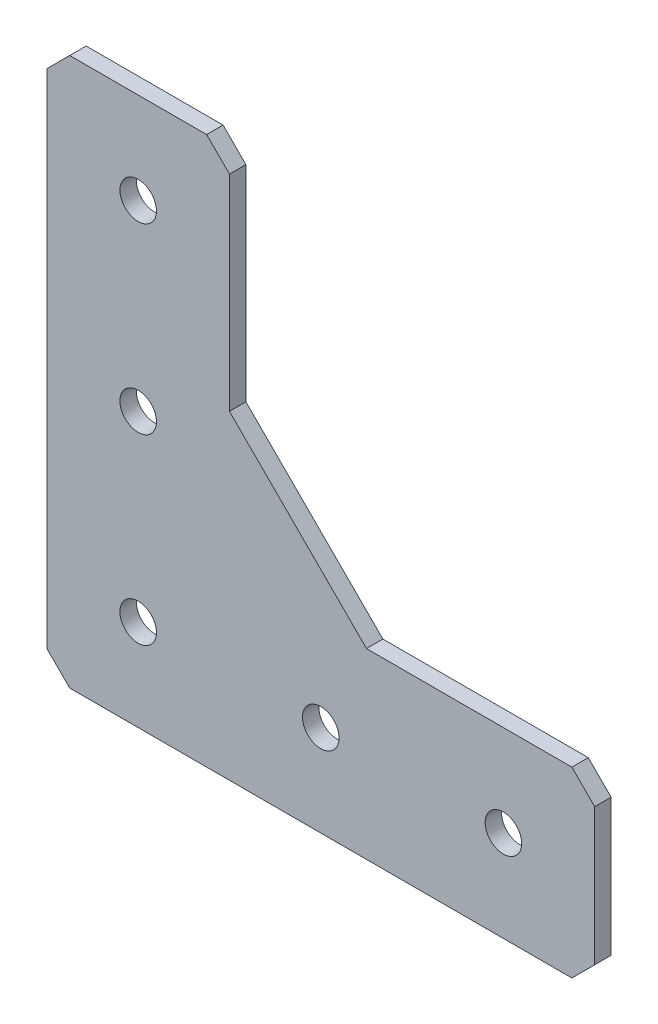
ISO-10303-21;
HEADER;
FILE_DESCRIPTION(('STEP AP214'),'2;1');
FILE_NAME('part.step','',(''),(''),'','','');
FILE_SCHEMA(('AUTOMOTIVE_DESIGN { 1 0 10303 214 1 1 1 1 }'));
ENDSEC;
DATA;
#1=APPLICATION_CONTEXT('core data for automotive mechanical design processes');
#2=APPLICATION_PROTOCOL_DEFINITION('international standard','automotive_design',2000,#1);
#3=PRODUCT_CONTEXT('',#1,'mechanical');
#4=PRODUCT('Part','Part','',(#3));
#5=PRODUCT_RELATED_PRODUCT_CATEGORY('part','',(#4));
#6=PRODUCT_DEFINITION_FORMATION('','',#4);
#7=PRODUCT_DEFINITION_CONTEXT('part definition',#1,'design');
#8=PRODUCT_DEFINITION('design','',#6,#7);
#9=PRODUCT_DEFINITION_SHAPE('','',#8);
#10=(LENGTH_UNIT() NAMED_UNIT(*) SI_UNIT(.MILLI.,.METRE.));
#11=(NAMED_UNIT(*) PLANE_ANGLE_UNIT() SI_UNIT($,.RADIAN.));
#12=(NAMED_UNIT(*) SI_UNIT($,.STERADIAN.) SOLID_ANGLE_UNIT());
#13=UNCERTAINTY_MEASURE_WITH_UNIT(LENGTH_MEASURE(1.E-05),#10,'distance_accuracy_value','');
#14=(GEOMETRIC_REPRESENTATION_CONTEXT(3) GLOBAL_UNCERTAINTY_ASSIGNED_CONTEXT((#13)) GLOBAL_UNIT_ASSIGNED_CONTEXT((#10,
#11,#12)) REPRESENTATION_CONTEXT('',''));
#15=CARTESIAN_POINT('',(0.,0.,0.));
#16=DIRECTION('',(0.,0.,1.));
#17=DIRECTION('',(1.,0.,0.));
#18=AXIS2_PLACEMENT_3D('',#15,#16,#17);
#19=CARTESIAN_POINT('',(44.45,25.4,2.286));
#20=DIRECTION('',(0.,1.,0.));
#21=DIRECTION('',(-1.,0.,0.));
#22=AXIS2_PLACEMENT_3D('',#19,#20,#21);
#23=PLANE('',#22);
#24=DIRECTION('',(1.,0.,0.));
#25=VECTOR('',#24,1.);
#26=CARTESIAN_POINT('',(44.45,25.4,0.));
#27=LINE('',#26,#25);
#28=CARTESIAN_POINT('',(44.45,25.4,0.));
#29=VERTEX_POINT('',#28);
#30=CARTESIAN_POINT('',(73.0249999999999,25.4,0.));
#31=VERTEX_POINT('',#30);
#32=EDGE_CURVE('E156',#29,#31,#27,.T.);
#33=ORIENTED_EDGE('',*,*,#32,.F.);
#34=DIRECTION('',(0.,0.,-1.));
#35=VECTOR('',#34,1.);
#36=CARTESIAN_POINT('',(44.45,25.4,2.286));
#37=LINE('',#36,#35);
#38=CARTESIAN_POINT('',(44.45,25.4,2.286));
#39=VERTEX_POINT('',#38);
#40=EDGE_CURVE('E11',#39,#29,#37,.T.);
#41=ORIENTED_EDGE('',*,*,#40,.F.);
#42=DIRECTION('',(1.,0.,0.));
#43=VECTOR('',#42,1.);
#44=CARTESIAN_POINT('',(44.45,25.4,2.286));
#45=LINE('',#44,#43);
#46=CARTESIAN_POINT('',(73.0249999999999,25.4,2.286));
#47=VERTEX_POINT('',#46);
#48=EDGE_CURVE('E189',#39,#47,#45,.T.);
#49=ORIENTED_EDGE('',*,*,#48,.T.);
#50=DIRECTION('',(0.,0.,-1.));
#51=VECTOR('',#50,1.);
#52=CARTESIAN_POINT('',(73.0249999999999,25.4,2.286));
#53=LINE('',#52,#51);
#54=EDGE_CURVE('E38',#47,#31,#53,.T.);
#55=ORIENTED_EDGE('',*,*,#54,.T.);
#56=EDGE_LOOP('',(#33,#41,#49,#55));
#57=FACE_BOUND('',#56,.T.);
#58=ADVANCED_FACE('F35',(#57),#23,.T.);
#59=CARTESIAN_POINT('',(25.4,44.4500000000001,2.286));
#60=DIRECTION('',(0.707106781186551,0.707106781186544,0.));
#61=DIRECTION('',(-0.707106781186544,0.707106781186551,0.));
#62=AXIS2_PLACEMENT_3D('',#59,#60,#61);
#63=PLANE('',#62);
#64=DIRECTION('',(0.707106781186544,-0.707106781186551,0.));
#65=VECTOR('',#64,1.);
#66=CARTESIAN_POINT('',(25.4,44.4500000000001,0.));
#67=LINE('',#66,#65);
#68=CARTESIAN_POINT('',(25.4,44.4500000000001,0.));
#69=VERTEX_POINT('',#68);
#70=EDGE_CURVE('E187',#69,#29,#67,.T.);
#71=ORIENTED_EDGE('',*,*,#70,.F.);
#72=DIRECTION('',(0.,0.,-1.));
#73=VECTOR('',#72,1.);
#74=CARTESIAN_POINT('',(25.4,44.4500000000001,2.286));
#75=LINE('',#74,#73);
#76=CARTESIAN_POINT('',(25.4,44.4500000000001,2.286));
#77=VERTEX_POINT('',#76);
#78=EDGE_CURVE('E44',#77,#69,#75,.T.);
#79=ORIENTED_EDGE('',*,*,#78,.F.);
#80=DIRECTION('',(0.707106781186544,-0.707106781186551,0.));
#81=VECTOR('',#80,1.);
#82=CARTESIAN_POINT('',(25.4,44.4500000000001,2.286));
#83=LINE('',#82,#81);
#84=EDGE_CURVE('E146',#77,#39,#83,.T.);
#85=ORIENTED_EDGE('',*,*,#84,.T.);
#86=ORIENTED_EDGE('',*,*,#40,.T.);
#87=EDGE_LOOP('',(#71,#79,#85,#86));
#88=FACE_BOUND('',#87,.T.);
#89=ADVANCED_FACE('F209',(#88),#63,.T.);
#90=CARTESIAN_POINT('',(25.4,73.025,2.286));
#91=DIRECTION('',(1.,0.,0.));
#92=DIRECTION('',(0.,1.,0.));
#93=AXIS2_PLACEMENT_3D('',#90,#91,#92);
#94=PLANE('',#93);
#95=DIRECTION('',(0.,-1.,0.));
#96=VECTOR('',#95,1.);
#97=CARTESIAN_POINT('',(25.4,73.025,0.));
#98=LINE('',#97,#96);
#99=CARTESIAN_POINT('',(25.4,73.025,0.));
#100=VERTEX_POINT('',#99);
#101=EDGE_CURVE('E133',#100,#69,#98,.T.);
#102=ORIENTED_EDGE('',*,*,#101,.F.);
#103=DIRECTION('',(0.,0.,-1.));
#104=VECTOR('',#103,1.);
#105=CARTESIAN_POINT('',(25.4,73.025,2.286));
#106=LINE('',#105,#104);
#107=CARTESIAN_POINT('',(25.4,73.025,2.286));
#108=VERTEX_POINT('',#107);
#109=EDGE_CURVE('E128',#108,#100,#106,.T.);
#110=ORIENTED_EDGE('',*,*,#109,.F.);
#111=DIRECTION('',(0.,-1.,0.));
#112=VECTOR('',#111,1.);
#113=CARTESIAN_POINT('',(25.4,73.025,2.286));
#114=LINE('',#113,#112);
#115=EDGE_CURVE('E131',#108,#77,#114,.T.);
#116=ORIENTED_EDGE('',*,*,#115,.T.);
#117=ORIENTED_EDGE('',*,*,#78,.T.);
#118=EDGE_LOOP('',(#102,#110,#116,#117));
#119=FACE_BOUND('',#118,.T.);
#120=ADVANCED_FACE('F130',(#119),#94,.T.);
#121=CARTESIAN_POINT('',(22.225,76.2,2.286));
#122=DIRECTION('',(0.707106781186549,0.707106781186546,0.));
#123=DIRECTION('',(-0.707106781186546,0.707106781186549,0.));
#124=AXIS2_PLACEMENT_3D('',#121,#122,#123);
#125=PLANE('',#124);
#126=DIRECTION('',(0.707106781186546,-0.707106781186549,0.));
#127=VECTOR('',#126,1.);
#128=CARTESIAN_POINT('',(22.225,76.2,0.));
#129=LINE('',#128,#127);
#130=CARTESIAN_POINT('',(22.225,76.2,0.));
#131=VERTEX_POINT('',#130);
#132=EDGE_CURVE('E184',#131,#100,#129,.T.);
#133=ORIENTED_EDGE('',*,*,#132,.F.);
#134=DIRECTION('',(0.,0.,-1.));
#135=VECTOR('',#134,1.);
#136=CARTESIAN_POINT('',(22.225,76.2,2.286));
#137=LINE('',#136,#135);
#138=CARTESIAN_POINT('',(22.225,76.2,2.286));
#139=VERTEX_POINT('',#138);
#140=EDGE_CURVE('E138',#139,#131,#137,.T.);
#141=ORIENTED_EDGE('',*,*,#140,.F.);
#142=DIRECTION('',(0.707106781186546,-0.707106781186549,0.));
#143=VECTOR('',#142,1.);
#144=CARTESIAN_POINT('',(22.225,76.2,2.286));
#145=LINE('',#144,#143);
#146=EDGE_CURVE('E144',#139,#108,#145,.T.);
#147=ORIENTED_EDGE('',*,*,#146,.T.);
#148=ORIENTED_EDGE('',*,*,#109,.T.);
#149=EDGE_LOOP('',(#133,#141,#147,#148));
#150=FACE_BOUND('',#149,.T.);
#151=ADVANCED_FACE('F148',(#150),#125,.T.);
#152=CARTESIAN_POINT('',(3.17500000000003,76.2,2.286));
#153=DIRECTION('',(0.,1.,0.));
#154=DIRECTION('',(0.,0.,1.));
#155=AXIS2_PLACEMENT_3D('',#152,#153,#154);
#156=PLANE('',#155);
#157=DIRECTION('',(1.,0.,0.));
#158=VECTOR('',#157,1.);
#159=CARTESIAN_POINT('',(3.17500000000003,76.2,0.));
#160=LINE('',#159,#158);
#161=CARTESIAN_POINT('',(3.17500000000003,76.2,0.));
#162=VERTEX_POINT('',#161);
#163=EDGE_CURVE('E181',#162,#131,#160,.T.);
#164=ORIENTED_EDGE('',*,*,#163,.F.);
#165=DIRECTION('',(0.,0.,-1.));
#166=VECTOR('',#165,1.);
#167=CARTESIAN_POINT('',(3.17500000000003,76.2,2.286));
#168=LINE('',#167,#166);
#169=CARTESIAN_POINT('',(3.17500000000003,76.2,2.286));
#170=VERTEX_POINT('',#169);
#171=EDGE_CURVE('E193',#170,#162,#168,.T.);
#172=ORIENTED_EDGE('',*,*,#171,.F.);
#173=DIRECTION('',(1.,0.,0.));
#174=VECTOR('',#173,1.);
#175=CARTESIAN_POINT('',(3.17500000000003,76.2,2.286));
#176=LINE('',#175,#174);
#177=EDGE_CURVE('E149',#170,#139,#176,.T.);
#178=ORIENTED_EDGE('',*,*,#177,.T.);
#179=ORIENTED_EDGE('',*,*,#140,.T.);
#180=EDGE_LOOP('',(#164,#172,#178,#179));
#181=FACE_BOUND('',#180,.T.);
#182=ADVANCED_FACE('F222',(#181),#156,.T.);
#183=CARTESIAN_POINT('',(0.,73.025,2.286));
#184=DIRECTION('',(-0.707106781186543,0.707106781186552,0.));
#185=DIRECTION('',(-0.707106781186552,-0.707106781186543,0.));
#186=AXIS2_PLACEMENT_3D('',#183,#184,#185);
#187=PLANE('',#186);
#188=DIRECTION('',(0.707106781186552,0.707106781186543,0.));
#189=VECTOR('',#188,1.);
#190=CARTESIAN_POINT('',(0.,73.025,0.));
#191=LINE('',#190,#189);
#192=CARTESIAN_POINT('',(0.,73.025,0.));
#193=VERTEX_POINT('',#192);
#194=EDGE_CURVE('E178',#193,#162,#191,.T.);
#195=ORIENTED_EDGE('',*,*,#194,.F.);
#196=DIRECTION('',(0.,0.,-1.));
#197=VECTOR('',#196,1.);
#198=CARTESIAN_POINT('',(0.,73.025,2.286));
#199=LINE('',#198,#197);
#200=CARTESIAN_POINT('',(0.,73.025,2.286));
#201=VERTEX_POINT('',#200);
#202=EDGE_CURVE('E195',#201,#193,#199,.T.);
#203=ORIENTED_EDGE('',*,*,#202,.F.);
#204=DIRECTION('',(0.707106781186552,0.707106781186543,0.));
#205=VECTOR('',#204,1.);
#206=CARTESIAN_POINT('',(0.,73.025,2.286));
#207=LINE('',#206,#205);
#208=EDGE_CURVE('E151',#201,#170,#207,.T.);
#209=ORIENTED_EDGE('',*,*,#208,.T.);
#210=ORIENTED_EDGE('',*,*,#171,.T.);
#211=EDGE_LOOP('',(#195,#203,#209,#210));
#212=FACE_BOUND('',#211,.T.);
#213=ADVANCED_FACE('F225',(#212),#187,.T.);
#214=CARTESIAN_POINT('',(0.,3.17500000000001,2.286));
#215=DIRECTION('',(-1.,0.,0.));
#216=DIRECTION('',(0.,-1.,0.));
#217=AXIS2_PLACEMENT_3D('',#214,#215,#216);
#218=PLANE('',#217);
#219=DIRECTION('',(0.,1.,0.));
#220=VECTOR('',#219,1.);
#221=CARTESIAN_POINT('',(0.,3.17500000000001,0.));
#222=LINE('',#221,#220);
#223=CARTESIAN_POINT('',(0.,3.17500000000001,0.));
#224=VERTEX_POINT('',#223);
#225=EDGE_CURVE('E175',#224,#193,#222,.T.);
#226=ORIENTED_EDGE('',*,*,#225,.F.);
#227=DIRECTION('',(0.,0.,-1.));
#228=VECTOR('',#227,1.);
#229=CARTESIAN_POINT('',(0.,3.17500000000001,2.286));
#230=LINE('',#229,#228);
#231=CARTESIAN_POINT('',(0.,3.17500000000001,2.286));
#232=VERTEX_POINT('',#231);
#233=EDGE_CURVE('E197',#232,#224,#230,.T.);
#234=ORIENTED_EDGE('',*,*,#233,.F.);
#235=DIRECTION('',(0.,1.,0.));
#236=VECTOR('',#235,1.);
#237=CARTESIAN_POINT('',(0.,3.17500000000001,2.286));
#238=LINE('',#237,#236);
#239=EDGE_CURVE('E329',#232,#201,#238,.T.);
#240=ORIENTED_EDGE('',*,*,#239,.T.);
#241=ORIENTED_EDGE('',*,*,#202,.T.);
#242=EDGE_LOOP('',(#226,#234,#240,#241));
#243=FACE_BOUND('',#242,.T.);
#244=ADVANCED_FACE('F229',(#243),#218,.T.);
#245=CARTESIAN_POINT('',(3.175,0.,2.286));
#246=DIRECTION('',(-0.707106781186549,-0.707106781186546,0.));
#247=DIRECTION('',(0.707106781186546,-0.707106781186549,0.));
#248=AXIS2_PLACEMENT_3D('',#245,#246,#247);
#249=PLANE('',#248);
#250=DIRECTION('',(-0.707106781186546,0.707106781186549,0.));
#251=VECTOR('',#250,1.);
#252=CARTESIAN_POINT('',(3.175,0.,0.));
#253=LINE('',#252,#251);
#254=CARTESIAN_POINT('',(3.175,0.,0.));
#255=VERTEX_POINT('',#254);
#256=EDGE_CURVE('E172',#255,#224,#253,.T.);
#257=ORIENTED_EDGE('',*,*,#256,.F.);
#258=DIRECTION('',(0.,0.,-1.));
#259=VECTOR('',#258,1.);
#260=CARTESIAN_POINT('',(3.175,0.,2.286));
#261=LINE('',#260,#259);
#262=CARTESIAN_POINT('',(3.175,0.,2.286));
#263=VERTEX_POINT('',#262);
#264=EDGE_CURVE('E199',#263,#255,#261,.T.);
#265=ORIENTED_EDGE('',*,*,#264,.F.);
#266=DIRECTION('',(-0.707106781186546,0.707106781186549,0.));
#267=VECTOR('',#266,1.);
#268=CARTESIAN_POINT('',(3.175,0.,2.286));
#269=LINE('',#268,#267);
#270=EDGE_CURVE('E326',#263,#232,#269,.T.);
#271=ORIENTED_EDGE('',*,*,#270,.T.);
#272=ORIENTED_EDGE('',*,*,#233,.T.);
#273=EDGE_LOOP('',(#257,#265,#271,#272));
#274=FACE_BOUND('',#273,.T.);
#275=ADVANCED_FACE('F233',(#274),#249,.T.);
#276=CARTESIAN_POINT('',(73.025,0.,2.286));
#277=DIRECTION('',(0.,-1.,0.));
#278=DIRECTION('',(1.,0.,0.));
#279=AXIS2_PLACEMENT_3D('',#276,#277,#278);
#280=PLANE('',#279);
#281=DIRECTION('',(-1.,0.,0.));
#282=VECTOR('',#281,1.);
#283=CARTESIAN_POINT('',(73.025,0.,0.));
#284=LINE('',#283,#282);
#285=CARTESIAN_POINT('',(73.025,0.,0.));
#286=VERTEX_POINT('',#285);
#287=EDGE_CURVE('E169',#286,#255,#284,.T.);
#288=ORIENTED_EDGE('',*,*,#287,.F.);
#289=DIRECTION('',(0.,0.,-1.));
#290=VECTOR('',#289,1.);
#291=CARTESIAN_POINT('',(73.025,0.,2.286));
#292=LINE('',#291,#290);
#293=CARTESIAN_POINT('',(73.025,0.,2.286));
#294=VERTEX_POINT('',#293);
#295=EDGE_CURVE('E201',#294,#286,#292,.T.);
#296=ORIENTED_EDGE('',*,*,#295,.F.);
#297=DIRECTION('',(-1.,0.,0.));
#298=VECTOR('',#297,1.);
#299=CARTESIAN_POINT('',(73.025,0.,2.286));
#300=LINE('',#299,#298);
#301=EDGE_CURVE('E323',#294,#263,#300,.T.);
#302=ORIENTED_EDGE('',*,*,#301,.T.);
#303=ORIENTED_EDGE('',*,*,#264,.T.);
#304=EDGE_LOOP('',(#288,#296,#302,#303));
#305=FACE_BOUND('',#304,.T.);
#306=ADVANCED_FACE('F237',(#305),#280,.T.);
#307=CARTESIAN_POINT('',(76.2,3.175,2.286));
#308=DIRECTION('',(0.707106781186546,-0.707106781186549,0.));
#309=DIRECTION('',(0.707106781186549,0.707106781186546,0.));
#310=AXIS2_PLACEMENT_3D('',#307,#308,#309);
#311=PLANE('',#310);
#312=DIRECTION('',(-0.707106781186549,-0.707106781186546,0.));
#313=VECTOR('',#312,1.);
#314=CARTESIAN_POINT('',(76.2,3.175,0.));
#315=LINE('',#314,#313);
#316=CARTESIAN_POINT('',(76.2,3.175,0.));
#317=VERTEX_POINT('',#316);
#318=EDGE_CURVE('E166',#317,#286,#315,.T.);
#319=ORIENTED_EDGE('',*,*,#318,.F.);
#320=DIRECTION('',(0.,0.,-1.));
#321=VECTOR('',#320,1.);
#322=CARTESIAN_POINT('',(76.2,3.175,2.286));
#323=LINE('',#322,#321);
#324=CARTESIAN_POINT('',(76.2,3.175,2.286));
#325=VERTEX_POINT('',#324);
#326=EDGE_CURVE('E203',#325,#317,#323,.T.);
#327=ORIENTED_EDGE('',*,*,#326,.F.);
#328=DIRECTION('',(-0.707106781186549,-0.707106781186546,0.));
#329=VECTOR('',#328,1.);
#330=CARTESIAN_POINT('',(76.2,3.175,2.286));
#331=LINE('',#330,#329);
#332=EDGE_CURVE('E320',#325,#294,#331,.T.);
#333=ORIENTED_EDGE('',*,*,#332,.T.);
#334=ORIENTED_EDGE('',*,*,#295,.T.);
#335=EDGE_LOOP('',(#319,#327,#333,#334));
#336=FACE_BOUND('',#335,.T.);
#337=ADVANCED_FACE('F241',(#336),#311,.T.);
#338=CARTESIAN_POINT('',(76.2,22.225,2.286));
#339=DIRECTION('',(1.,0.,0.));
#340=DIRECTION('',(0.,0.,-1.));
#341=AXIS2_PLACEMENT_3D('',#338,#339,#340);
#342=PLANE('',#341);
#343=DIRECTION('',(0.,-1.,0.));
#344=VECTOR('',#343,1.);
#345=CARTESIAN_POINT('',(76.2,22.225,0.));
#346=LINE('',#345,#344);
#347=CARTESIAN_POINT('',(76.2,22.225,0.));
#348=VERTEX_POINT('',#347);
#349=EDGE_CURVE('E163',#348,#317,#346,.T.);
#350=ORIENTED_EDGE('',*,*,#349,.F.);
#351=DIRECTION('',(0.,0.,-1.));
#352=VECTOR('',#351,1.);
#353=CARTESIAN_POINT('',(76.2,22.225,2.286));
#354=LINE('',#353,#352);
#355=CARTESIAN_POINT('',(76.2,22.225,2.286));
#356=VERTEX_POINT('',#355);
#357=EDGE_CURVE('E204',#356,#348,#354,.T.);
#358=ORIENTED_EDGE('',*,*,#357,.F.);
#359=DIRECTION('',(0.,-1.,0.));
#360=VECTOR('',#359,1.);
#361=CARTESIAN_POINT('',(76.2,22.225,2.286));
#362=LINE('',#361,#360);
#363=EDGE_CURVE('E317',#356,#325,#362,.T.);
#364=ORIENTED_EDGE('',*,*,#363,.T.);
#365=ORIENTED_EDGE('',*,*,#326,.T.);
#366=EDGE_LOOP('',(#350,#358,#364,#365));
#367=FACE_BOUND('',#366,.T.);
#368=ADVANCED_FACE('F245',(#367),#342,.T.);
#369=CARTESIAN_POINT('',(73.0249999999999,25.4,2.286));
#370=DIRECTION('',(0.707106781186546,0.707106781186549,0.));
#371=DIRECTION('',(-0.707106781186549,0.707106781186546,0.));
#372=AXIS2_PLACEMENT_3D('',#369,#370,#371);
#373=PLANE('',#372);
#374=DIRECTION('',(0.707106781186549,-0.707106781186546,0.));
#375=VECTOR('',#374,1.);
#376=CARTESIAN_POINT('',(73.0249999999999,25.4,0.));
#377=LINE('',#376,#375);
#378=EDGE_CURVE('E159',#31,#348,#377,.T.);
#379=ORIENTED_EDGE('',*,*,#378,.F.);
#380=ORIENTED_EDGE('',*,*,#54,.F.);
#381=DIRECTION('',(0.707106781186549,-0.707106781186546,0.));
#382=VECTOR('',#381,1.);
#383=CARTESIAN_POINT('',(73.0249999999999,25.4,2.286));
#384=LINE('',#383,#382);
#385=EDGE_CURVE('E315',#47,#356,#384,.T.);
#386=ORIENTED_EDGE('',*,*,#385,.T.);
#387=ORIENTED_EDGE('',*,*,#357,.T.);
#388=EDGE_LOOP('',(#379,#380,#386,#387));
#389=FACE_BOUND('',#388,.T.);
#390=ADVANCED_FACE('F206',(#389),#373,.T.);
#391=CARTESIAN_POINT('',(0.,0.,2.286));
#392=DIRECTION('',(0.,0.,-1.));
#393=DIRECTION('',(-1.,0.,0.));
#394=AXIS2_PLACEMENT_3D('',#391,#392,#393);
#395=PLANE('',#394);
#396=CARTESIAN_POINT('',(38.1,12.7,2.286));
#397=DIRECTION('',(0.,0.,-1.));
#398=DIRECTION('',(1.,0.,0.));
#399=AXIS2_PLACEMENT_3D('',#396,#397,#398);
#400=CIRCLE('',#399,2.53999999999999);
#401=CARTESIAN_POINT('',(40.64,12.7,2.286));
#402=VERTEX_POINT('',#401);
#403=EDGE_CURVE('E284',#402,#402,#400,.T.);
#404=ORIENTED_EDGE('',*,*,#403,.T.);
#405=EDGE_LOOP('',(#404));
#406=FACE_BOUND('',#405,.T.);
#407=CARTESIAN_POINT('',(63.5,12.7,2.286));
#408=DIRECTION('',(0.,0.,-1.));
#409=DIRECTION('',(1.,0.,0.));
#410=AXIS2_PLACEMENT_3D('',#407,#408,#409);
#411=CIRCLE('',#410,2.54);
#412=CARTESIAN_POINT('',(66.04,12.7,2.286));
#413=VERTEX_POINT('',#412);
#414=EDGE_CURVE('E292',#413,#413,#411,.T.);
#415=ORIENTED_EDGE('',*,*,#414,.T.);
#416=EDGE_LOOP('',(#415));
#417=FACE_BOUND('',#416,.T.);
#418=CARTESIAN_POINT('',(12.7,38.1,2.286));
#419=DIRECTION('',(0.,0.,-1.));
#420=DIRECTION('',(1.,0.,0.));
#421=AXIS2_PLACEMENT_3D('',#418,#419,#420);
#422=CIRCLE('',#421,2.53999999999999);
#423=CARTESIAN_POINT('',(15.24,38.1,2.286));
#424=VERTEX_POINT('',#423);
#425=EDGE_CURVE('E298',#424,#424,#422,.T.);
#426=ORIENTED_EDGE('',*,*,#425,.T.);
#427=EDGE_LOOP('',(#426));
#428=FACE_BOUND('',#427,.T.);
#429=CARTESIAN_POINT('',(12.7,63.5,2.286));
#430=DIRECTION('',(0.,0.,-1.));
#431=DIRECTION('',(1.,0.,0.));
#432=AXIS2_PLACEMENT_3D('',#429,#430,#431);
#433=CIRCLE('',#432,2.53999999999999);
#434=CARTESIAN_POINT('',(15.24,63.5,2.286));
#435=VERTEX_POINT('',#434);
#436=EDGE_CURVE('E304',#435,#435,#433,.T.);
#437=ORIENTED_EDGE('',*,*,#436,.T.);
#438=EDGE_LOOP('',(#437));
#439=FACE_BOUND('',#438,.T.);
#440=CARTESIAN_POINT('',(12.7,12.7,2.286));
#441=DIRECTION('',(0.,0.,-1.));
#442=DIRECTION('',(1.,0.,0.));
#443=AXIS2_PLACEMENT_3D('',#440,#441,#442);
#444=CIRCLE('',#443,2.53999999999999);
#445=CARTESIAN_POINT('',(15.24,12.7,2.286));
#446=VERTEX_POINT('',#445);
#447=EDGE_CURVE('E160',#446,#446,#444,.T.);
#448=ORIENTED_EDGE('',*,*,#447,.T.);
#449=EDGE_LOOP('',(#448));
#450=FACE_BOUND('',#449,.T.);
#451=ORIENTED_EDGE('',*,*,#48,.F.);
#452=ORIENTED_EDGE('',*,*,#84,.F.);
#453=ORIENTED_EDGE('',*,*,#115,.F.);
#454=ORIENTED_EDGE('',*,*,#146,.F.);
#455=ORIENTED_EDGE('',*,*,#177,.F.);
#456=ORIENTED_EDGE('',*,*,#208,.F.);
#457=ORIENTED_EDGE('',*,*,#239,.F.);
#458=ORIENTED_EDGE('',*,*,#270,.F.);
#459=ORIENTED_EDGE('',*,*,#301,.F.);
#460=ORIENTED_EDGE('',*,*,#332,.F.);
#461=ORIENTED_EDGE('',*,*,#363,.F.);
#462=ORIENTED_EDGE('',*,*,#385,.F.);
#463=EDGE_LOOP('',(#451,#452,#453,#454,#455,#456,#457,#458,#459,#460,#461,#462));
#464=FACE_BOUND('',#463,.T.);
#465=ADVANCED_FACE('F142',(#406,#417,#428,#439,#450,#464),#395,.F.);
#466=CARTESIAN_POINT('',(0.,0.,0.));
#467=DIRECTION('',(0.,0.,-1.));
#468=DIRECTION('',(-1.,0.,0.));
#469=AXIS2_PLACEMENT_3D('',#466,#467,#468);
#470=PLANE('',#469);
#471=CARTESIAN_POINT('',(38.1,12.7,0.));
#472=DIRECTION('',(0.,0.,-1.));
#473=DIRECTION('',(1.,0.,0.));
#474=AXIS2_PLACEMENT_3D('',#471,#472,#473);
#475=CIRCLE('',#474,2.53999999999999);
#476=CARTESIAN_POINT('',(40.64,12.7,0.));
#477=VERTEX_POINT('',#476);
#478=EDGE_CURVE('E287',#477,#477,#475,.T.);
#479=ORIENTED_EDGE('',*,*,#478,.F.);
#480=EDGE_LOOP('',(#479));
#481=FACE_BOUND('',#480,.T.);
#482=CARTESIAN_POINT('',(63.5,12.7,0.));
#483=DIRECTION('',(0.,0.,-1.));
#484=DIRECTION('',(1.,0.,0.));
#485=AXIS2_PLACEMENT_3D('',#482,#483,#484);
#486=CIRCLE('',#485,2.54);
#487=CARTESIAN_POINT('',(66.04,12.7,0.));
#488=VERTEX_POINT('',#487);
#489=EDGE_CURVE('E289',#488,#488,#486,.T.);
#490=ORIENTED_EDGE('',*,*,#489,.F.);
#491=EDGE_LOOP('',(#490));
#492=FACE_BOUND('',#491,.T.);
#493=CARTESIAN_POINT('',(12.7,38.1,0.));
#494=DIRECTION('',(0.,0.,-1.));
#495=DIRECTION('',(1.,0.,0.));
#496=AXIS2_PLACEMENT_3D('',#493,#494,#495);
#497=CIRCLE('',#496,2.53999999999999);
#498=CARTESIAN_POINT('',(15.24,38.1,0.));
#499=VERTEX_POINT('',#498);
#500=EDGE_CURVE('E295',#499,#499,#497,.T.);
#501=ORIENTED_EDGE('',*,*,#500,.F.);
#502=EDGE_LOOP('',(#501));
#503=FACE_BOUND('',#502,.T.);
#504=CARTESIAN_POINT('',(12.7,63.5,0.));
#505=DIRECTION('',(0.,0.,-1.));
#506=DIRECTION('',(1.,0.,0.));
#507=AXIS2_PLACEMENT_3D('',#504,#505,#506);
#508=CIRCLE('',#507,2.53999999999999);
#509=CARTESIAN_POINT('',(15.24,63.5,0.));
#510=VERTEX_POINT('',#509);
#511=EDGE_CURVE('E301',#510,#510,#508,.T.);
#512=ORIENTED_EDGE('',*,*,#511,.F.);
#513=EDGE_LOOP('',(#512));
#514=FACE_BOUND('',#513,.T.);
#515=CARTESIAN_POINT('',(12.7,12.7,0.));
#516=DIRECTION('',(0.,0.,-1.));
#517=DIRECTION('',(1.,0.,0.));
#518=AXIS2_PLACEMENT_3D('',#515,#516,#517);
#519=CIRCLE('',#518,2.53999999999999);
#520=CARTESIAN_POINT('',(15.24,12.7,0.));
#521=VERTEX_POINT('',#520);
#522=EDGE_CURVE('E307',#521,#521,#519,.T.);
#523=ORIENTED_EDGE('',*,*,#522,.F.);
#524=EDGE_LOOP('',(#523));
#525=FACE_BOUND('',#524,.T.);
#526=ORIENTED_EDGE('',*,*,#32,.T.);
#527=ORIENTED_EDGE('',*,*,#378,.T.);
#528=ORIENTED_EDGE('',*,*,#349,.T.);
#529=ORIENTED_EDGE('',*,*,#318,.T.);
#530=ORIENTED_EDGE('',*,*,#287,.T.);
#531=ORIENTED_EDGE('',*,*,#256,.T.);
#532=ORIENTED_EDGE('',*,*,#225,.T.);
#533=ORIENTED_EDGE('',*,*,#194,.T.);
#534=ORIENTED_EDGE('',*,*,#163,.T.);
#535=ORIENTED_EDGE('',*,*,#132,.T.);
#536=ORIENTED_EDGE('',*,*,#101,.T.);
#537=ORIENTED_EDGE('',*,*,#70,.T.);
#538=EDGE_LOOP('',(#526,#527,#528,#529,#530,#531,#532,#533,#534,#535,#536,#537));
#539=FACE_BOUND('',#538,.T.);
#540=ADVANCED_FACE('F208',(#481,#492,#503,#514,#525,#539),#470,.T.);
#541=CARTESIAN_POINT('',(12.7,12.7,2.286));
#542=DIRECTION('',(0.,0.,-1.));
#543=DIRECTION('',(-1.,0.,0.));
#544=AXIS2_PLACEMENT_3D('',#541,#542,#543);
#545=CYLINDRICAL_SURFACE('',#544,2.53999999999999);
#546=ORIENTED_EDGE('',*,*,#447,.F.);
#547=EDGE_LOOP('',(#546));
#548=FACE_BOUND('',#547,.T.);
#549=ORIENTED_EDGE('',*,*,#522,.T.);
#550=EDGE_LOOP('',(#549));
#551=FACE_BOUND('',#550,.T.);
#552=ADVANCED_FACE('F257',(#548,#551),#545,.F.);
#553=CARTESIAN_POINT('',(12.7,63.5,2.286));
#554=DIRECTION('',(0.,0.,-1.));
#555=DIRECTION('',(-1.,0.,0.));
#556=AXIS2_PLACEMENT_3D('',#553,#554,#555);
#557=CYLINDRICAL_SURFACE('',#556,2.53999999999999);
#558=ORIENTED_EDGE('',*,*,#436,.F.);
#559=EDGE_LOOP('',(#558));
#560=FACE_BOUND('',#559,.T.);
#561=ORIENTED_EDGE('',*,*,#511,.T.);
#562=EDGE_LOOP('',(#561));
#563=FACE_BOUND('',#562,.T.);
#564=ADVANCED_FACE('F264',(#560,#563),#557,.F.);
#565=CARTESIAN_POINT('',(12.7,38.1,2.286));
#566=DIRECTION('',(0.,0.,-1.));
#567=DIRECTION('',(-1.,0.,0.));
#568=AXIS2_PLACEMENT_3D('',#565,#566,#567);
#569=CYLINDRICAL_SURFACE('',#568,2.53999999999999);
#570=ORIENTED_EDGE('',*,*,#425,.F.);
#571=EDGE_LOOP('',(#570));
#572=FACE_BOUND('',#571,.T.);
#573=ORIENTED_EDGE('',*,*,#500,.T.);
#574=EDGE_LOOP('',(#573));
#575=FACE_BOUND('',#574,.T.);
#576=ADVANCED_FACE('F268',(#572,#575),#569,.F.);
#577=CARTESIAN_POINT('',(63.5,12.7,2.286));
#578=DIRECTION('',(0.,0.,-1.));
#579=DIRECTION('',(-1.,0.,0.));
#580=AXIS2_PLACEMENT_3D('',#577,#578,#579);
#581=CYLINDRICAL_SURFACE('',#580,2.54);
#582=ORIENTED_EDGE('',*,*,#414,.F.);
#583=EDGE_LOOP('',(#582));
#584=FACE_BOUND('',#583,.T.);
#585=ORIENTED_EDGE('',*,*,#489,.T.);
#586=EDGE_LOOP('',(#585));
#587=FACE_BOUND('',#586,.T.);
#588=ADVANCED_FACE('F272',(#584,#587),#581,.F.);
#589=CARTESIAN_POINT('',(38.1,12.7,2.286));
#590=DIRECTION('',(0.,0.,-1.));
#591=DIRECTION('',(-1.,0.,0.));
#592=AXIS2_PLACEMENT_3D('',#589,#590,#591);
#593=CYLINDRICAL_SURFACE('',#592,2.53999999999999);
#594=ORIENTED_EDGE('',*,*,#403,.F.);
#595=EDGE_LOOP('',(#594));
#596=FACE_BOUND('',#595,.T.);
#597=ORIENTED_EDGE('',*,*,#478,.T.);
#598=EDGE_LOOP('',(#597));
#599=FACE_BOUND('',#598,.T.);
#600=ADVANCED_FACE('F276',(#596,#599),#593,.F.);
#601=CLOSED_SHELL('',(#58,#89,#120,#151,#182,#213,#244,#275,#306,#337,#368,#390,#465,#540,#552,
#564,#576,#588,#600));
#602=MANIFOLD_SOLID_BREP('B2',#601);
#603=ADVANCED_BREP_SHAPE_REPRESENTATION('',(#18,#602),#14);
#604=SHAPE_DEFINITION_REPRESENTATION(#9,#603);
ENDSEC;
END-ISO-10303-21;
